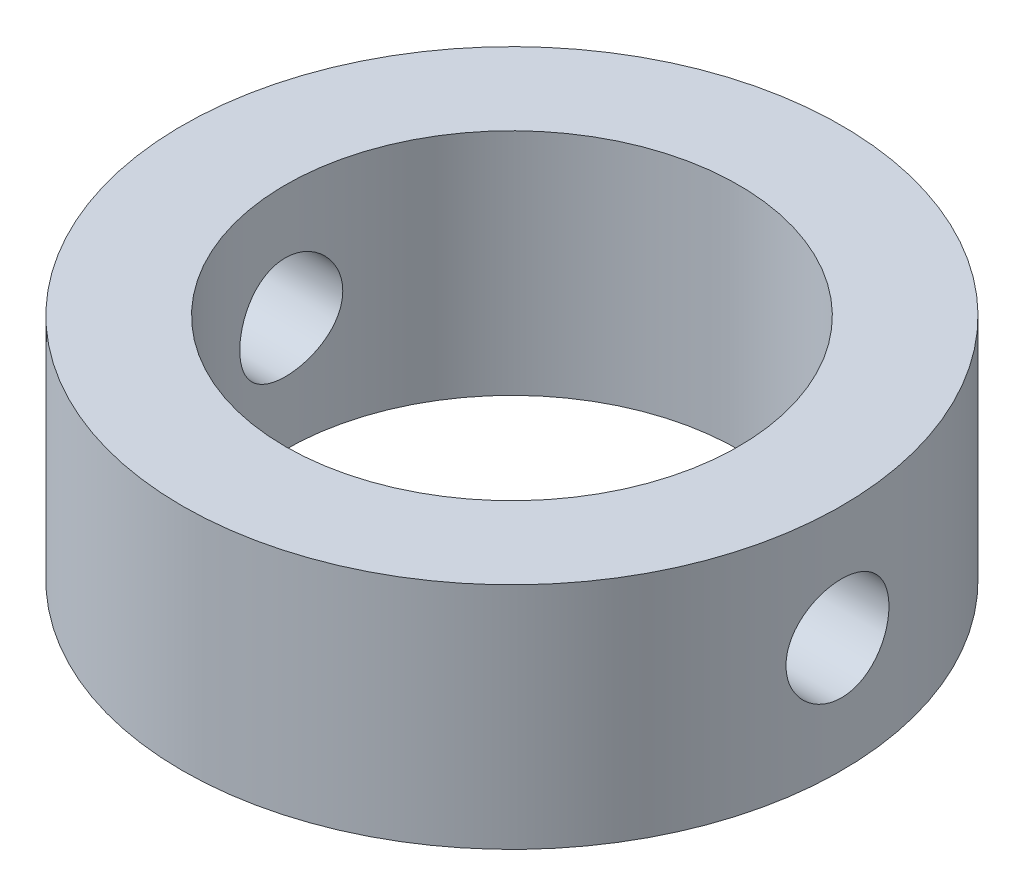
ISO-10303-21;
HEADER;
FILE_DESCRIPTION(('STEP AP214'),'2;1');
FILE_NAME('part.step','',(''),(''),'','','');
FILE_SCHEMA(('AUTOMOTIVE_DESIGN { 1 0 10303 214 1 1 1 1 }'));
ENDSEC;
DATA;
#1=APPLICATION_CONTEXT('core data for automotive mechanical design processes');
#2=APPLICATION_PROTOCOL_DEFINITION('international standard','automotive_design',2000,#1);
#3=PRODUCT_CONTEXT('',#1,'mechanical');
#4=PRODUCT('Part','Part','',(#3));
#5=PRODUCT_RELATED_PRODUCT_CATEGORY('part','',(#4));
#6=PRODUCT_DEFINITION_FORMATION('','',#4);
#7=PRODUCT_DEFINITION_CONTEXT('part definition',#1,'design');
#8=PRODUCT_DEFINITION('design','',#6,#7);
#9=PRODUCT_DEFINITION_SHAPE('','',#8);
#10=(LENGTH_UNIT() NAMED_UNIT(*) SI_UNIT(.MILLI.,.METRE.));
#11=(NAMED_UNIT(*) PLANE_ANGLE_UNIT() SI_UNIT($,.RADIAN.));
#12=(NAMED_UNIT(*) SI_UNIT($,.STERADIAN.) SOLID_ANGLE_UNIT());
#13=UNCERTAINTY_MEASURE_WITH_UNIT(LENGTH_MEASURE(1.E-05),#10,'distance_accuracy_value','');
#14=(GEOMETRIC_REPRESENTATION_CONTEXT(3) GLOBAL_UNCERTAINTY_ASSIGNED_CONTEXT((#13)) GLOBAL_UNIT_ASSIGNED_CONTEXT((#10,
#11,#12)) REPRESENTATION_CONTEXT('',''));
#15=CARTESIAN_POINT('',(0.,0.,0.));
#16=DIRECTION('',(0.,0.,1.));
#17=DIRECTION('',(1.,0.,0.));
#18=AXIS2_PLACEMENT_3D('',#15,#16,#17);
#19=CARTESIAN_POINT('',(0.,18.4550477399727,0.));
#20=DIRECTION('',(0.,1.,0.));
#21=DIRECTION('',(0.,0.,1.));
#22=AXIS2_PLACEMENT_3D('',#19,#20,#21);
#23=CYLINDRICAL_SURFACE('',#22,11.);
#24=CARTESIAN_POINT('',(-10.7121426428143,0.,-2.5));
#25=CARTESIAN_POINT('',(-10.7121454314233,0.138466190954528,-2.49999543238962));
#26=CARTESIAN_POINT('',(-10.7148566472694,0.276986082337185,-2.48845712333954));
#27=CARTESIAN_POINT('',(-10.7253866484904,0.550076575056332,-2.44266520236751));
#28=CARTESIAN_POINT('',(-10.7332089369474,0.684644401534488,-2.40839601066357));
#29=CARTESIAN_POINT('',(-10.7530304465065,0.945841058373466,-2.31828540377217));
#30=CARTESIAN_POINT('',(-10.7650248735991,1.07247880458495,-2.26246873972878));
#31=CARTESIAN_POINT('',(-10.7918333757398,1.31459839968131,-2.13091974990438));
#32=CARTESIAN_POINT('',(-10.8066474399211,1.43008029155815,-2.05518750087741));
#33=CARTESIAN_POINT('',(-10.8377278041731,1.6487154808709,-1.88448528035886));
#34=CARTESIAN_POINT('',(-10.8540139214629,1.75163578041055,-1.78922044020224));
#35=CARTESIAN_POINT('',(-10.8860302886159,1.94018250510919,-1.58279346057436));
#36=CARTESIAN_POINT('',(-10.9017604930117,2.02580751839435,-1.4716300245101));
#37=CARTESIAN_POINT('',(-10.93110941005,2.17826304827206,-1.23499021284435));
#38=CARTESIAN_POINT('',(-10.9447020098483,2.24486820043069,-1.10936512825883));
#39=CARTESIAN_POINT('',(-10.9680197641523,2.35593341841309,-0.848343855636442));
#40=CARTESIAN_POINT('',(-10.9777453878714,2.40039617113036,-0.712948855424522));
#41=CARTESIAN_POINT('',(-10.992093320832,2.4651780957488,-0.438655593897397));
#42=CARTESIAN_POINT('',(-10.9967989680676,2.48589197735748,-0.299854987503796));
#43=CARTESIAN_POINT('',(-11.0008659279287,2.5038235330812,-0.0206744590410417));
#44=CARTESIAN_POINT('',(-11.0002278985982,2.50104410026593,0.119705266442305));
#45=CARTESIAN_POINT('',(-10.9937426547597,2.47235927142653,0.395333870912044));
#46=CARTESIAN_POINT('',(-10.9879913110538,2.44687947198624,0.53062963162453));
#47=CARTESIAN_POINT('',(-10.972035500945,2.37419692034856,0.794973031158361));
#48=CARTESIAN_POINT('',(-10.9618308229987,2.32699313620665,0.92402037284203));
#49=CARTESIAN_POINT('',(-10.9379627182996,2.21183459013289,1.17336944375684));
#50=CARTESIAN_POINT('',(-10.9242729764965,2.14372109926423,1.29359524399307));
#51=CARTESIAN_POINT('',(-10.8949317146097,1.9887954880441,1.52106399956616));
#52=CARTESIAN_POINT('',(-10.8792799076932,1.90198063241803,1.62830505215689));
#53=CARTESIAN_POINT('',(-10.8473171066438,1.7098085843367,1.82929354427355));
#54=CARTESIAN_POINT('',(-10.8309992019581,1.60407898919961,1.92268414978479));
#55=CARTESIAN_POINT('',(-10.7998704044976,1.37828918426258,2.09047920073133));
#56=CARTESIAN_POINT('',(-10.7850595594488,1.25822852088493,2.16488304500243));
#57=CARTESIAN_POINT('',(-10.7586016791364,1.00657601189026,2.29276887377835));
#58=CARTESIAN_POINT('',(-10.7469656031437,0.874946246080213,2.3461786596901));
#59=CARTESIAN_POINT('',(-10.7283231226734,0.604251446260693,2.43000958929392));
#60=CARTESIAN_POINT('',(-10.7213159185924,0.465187700904694,2.46043470354816));
#61=CARTESIAN_POINT('',(-10.7128889420635,0.186845752338146,2.49686920193376));
#62=CARTESIAN_POINT('',(-10.7113498101725,0.0476393671862799,2.50340025202094));
#63=CARTESIAN_POINT('',(-10.7137104989267,-0.229873208145283,2.49327772715816));
#64=CARTESIAN_POINT('',(-10.7176099135701,-0.36817946474759,2.47662588287242));
#65=CARTESIAN_POINT('',(-10.7302951733771,-0.638118293808386,2.42106417661717));
#66=CARTESIAN_POINT('',(-10.7390169712549,-0.769814166805823,2.38244586746638));
#67=CARTESIAN_POINT('',(-10.7603057031402,-1.02486559243074,2.28436509536444));
#68=CARTESIAN_POINT('',(-10.7728730289421,-1.14822029366921,2.22490050843923));
#69=CARTESIAN_POINT('',(-10.8006961734274,-1.38533303903934,2.08568096094998));
#70=CARTESIAN_POINT('',(-10.8159929667106,-1.49889893904089,2.00560710889276));
#71=CARTESIAN_POINT('',(-10.847445444588,-1.71117330324603,1.82785558175614));
#72=CARTESIAN_POINT('',(-10.8636012445728,-1.80987976451868,1.73017553739798));
#73=CARTESIAN_POINT('',(-10.8953477425749,-1.99168109801583,1.51761489811828));
#74=CARTESIAN_POINT('',(-10.9109203453324,-2.07441892472079,1.40242575322726));
#75=CARTESIAN_POINT('',(-10.9394030007809,-2.21937081430505,1.15948167628699));
#76=CARTESIAN_POINT('',(-10.9523131827213,-2.28158587356556,1.03172735466865));
#77=CARTESIAN_POINT('',(-10.9739405859898,-2.38324041107997,0.768105049315911));
#78=CARTESIAN_POINT('',(-10.9826854368624,-2.42283032739891,0.6322974462709));
#79=CARTESIAN_POINT('',(-10.9951167589318,-2.47857654735429,0.355736283082475));
#80=CARTESIAN_POINT('',(-10.9988040274401,-2.4947365446643,0.214983506118723));
#81=CARTESIAN_POINT('',(-11.0006787302882,-2.50298711617191,-0.0640926427285491));
#82=CARTESIAN_POINT('',(-10.9989875888252,-2.49560907850598,-0.202399752438727));
#83=CARTESIAN_POINT('',(-10.9905580161125,-2.45818905132186,-0.475747789729384));
#84=CARTESIAN_POINT('',(-10.9838196900264,-2.42814753402196,-0.6107887853024));
#85=CARTESIAN_POINT('',(-10.96606448264,-2.3465163607887,-0.873322034218739));
#86=CARTESIAN_POINT('',(-10.9550636655368,-2.29500755489862,-1.00084058283969));
#87=CARTESIAN_POINT('',(-10.9299536917879,-2.17198077313979,-1.24549315867952));
#88=CARTESIAN_POINT('',(-10.9158442081789,-2.10046069231224,-1.36262609174177));
#89=CARTESIAN_POINT('',(-10.8856935133435,-1.93773803535717,-1.58575630284182));
#90=CARTESIAN_POINT('',(-10.8696188788032,-1.84616508560281,-1.69147898146279));
#91=CARTESIAN_POINT('',(-10.8375213996161,-1.64667602970222,-1.88623829979112));
#92=CARTESIAN_POINT('',(-10.8214985685478,-1.53875594541497,-1.97527086605942));
#93=CARTESIAN_POINT('',(-10.7910549272231,-1.30772800618311,-2.13539007203787));
#94=CARTESIAN_POINT('',(-10.7766611159887,-1.18442028714458,-2.2061937971019));
#95=CARTESIAN_POINT('',(-10.7514502387736,-0.927351148743042,-2.32596037579883));
#96=CARTESIAN_POINT('',(-10.7406302556445,-0.793598366019797,-2.37494105401434));
#97=CARTESIAN_POINT('',(-10.72571344068,-0.54983204252996,-2.44129910462464));
#98=CARTESIAN_POINT('',(-10.7206593017667,-0.441103827426283,-2.46326828297558));
#99=CARTESIAN_POINT('',(-10.7138728814852,-0.221595128190535,-2.49262014337059));
#100=CARTESIAN_POINT('',(-10.712140411085,-0.110814761206151,-2.50000365546745));
#101=CARTESIAN_POINT('',(-10.7121426428143,0.,-2.5));
#102=B_SPLINE_CURVE_WITH_KNOTS('',3,(#24,#25,#26,#27,#28,#29,#30,#31,#32,#33,#34,#35,#36,#37,
#38,#39,#40,#41,#42,#43,#44,#45,#46,#47,#48,#49,#50,#51,#52,#53,#54,#55,#56,#57,#58,#59,#60,#61,
#62,#63,#64,#65,#66,#67,#68,#69,#70,#71,#72,#73,#74,#75,#76,#77,#78,#79,#80,#81,#82,#83,#84,#85,
#86,#87,#88,#89,#90,#91,#92,#93,#94,#95,#96,#97,#98,#99,#100,#101),.UNSPECIFIED.,.T.,.F.,(4,2,2,
2,2,2,2,2,2,2,2,2,2,2,2,2,2,2,2,2,2,2,2,2,2,2,2,2,2,2,2,2,2,2,2,2,2,2,4),(0.,0.414992243301631,
0.83026921724478,1.2450705835768,1.65987035130107,2.08146637272044,2.5030967965796,
2.92953338750108,3.35591821939512,3.77510878183784,4.1942477240696,4.60569006667321,
5.01715195585207,5.43181796836808,5.84654467145158,6.27057865094874,6.69462605466424,
7.12011925968861,7.54553894468119,7.96161330230364,8.37765660054312,8.78830262277903,
9.19899049685668,9.61646120958421,10.0339881436657,10.4599792598124,10.8859496910277,
11.3090538013157,11.7320912029453,12.1456463784943,12.5591929374091,12.9711958750873,
13.3832421670976,13.8036601623803,14.2241806329332,14.6508801056332,15.0772304178392,
15.4093684172414,15.7414875145232),.UNSPECIFIED.);
#103=CARTESIAN_POINT('',(-10.7121426428143,0.,-2.5));
#104=VERTEX_POINT('',#103);
#105=EDGE_CURVE('E76',#104,#104,#102,.T.);
#106=ORIENTED_EDGE('',*,*,#105,.F.);
#107=EDGE_LOOP('',(#106));
#108=FACE_BOUND('',#107,.T.);
#109=CARTESIAN_POINT('',(10.7121426428143,0.,-2.5));
#110=CARTESIAN_POINT('',(10.7121454314233,-0.138466190954528,-2.49999543238962));
#111=CARTESIAN_POINT('',(10.7148566472694,-0.276986082337185,-2.48845712333954));
#112=CARTESIAN_POINT('',(10.7253866484904,-0.550076575056332,-2.44266520236751));
#113=CARTESIAN_POINT('',(10.7332089369474,-0.684644401534488,-2.40839601066357));
#114=CARTESIAN_POINT('',(10.7530304465065,-0.945841058373466,-2.31828540377217));
#115=CARTESIAN_POINT('',(10.7650248735991,-1.07247880458495,-2.26246873972878));
#116=CARTESIAN_POINT('',(10.7918333757398,-1.31459839968131,-2.13091974990438));
#117=CARTESIAN_POINT('',(10.8066474399211,-1.43008029155815,-2.05518750087741));
#118=CARTESIAN_POINT('',(10.8377278041731,-1.6487154808709,-1.88448528035886));
#119=CARTESIAN_POINT('',(10.8540139214629,-1.75163578041055,-1.78922044020224));
#120=CARTESIAN_POINT('',(10.8860302886159,-1.94018250510919,-1.58279346057436));
#121=CARTESIAN_POINT('',(10.9017604930117,-2.02580751839435,-1.4716300245101));
#122=CARTESIAN_POINT('',(10.93110941005,-2.17826304827206,-1.23499021284435));
#123=CARTESIAN_POINT('',(10.9447020098483,-2.24486820043069,-1.10936512825883));
#124=CARTESIAN_POINT('',(10.9680197641523,-2.35593341841309,-0.848343855636442));
#125=CARTESIAN_POINT('',(10.9777453878714,-2.40039617113036,-0.712948855424522));
#126=CARTESIAN_POINT('',(10.992093320832,-2.4651780957488,-0.438655593897397));
#127=CARTESIAN_POINT('',(10.9967989680676,-2.48589197735748,-0.299854987503796));
#128=CARTESIAN_POINT('',(11.0008659279287,-2.5038235330812,-0.0206744590410417));
#129=CARTESIAN_POINT('',(11.0002278985982,-2.50104410026593,0.119705266442305));
#130=CARTESIAN_POINT('',(10.9937426547597,-2.47235927142653,0.395333870912044));
#131=CARTESIAN_POINT('',(10.9879913110538,-2.44687947198624,0.53062963162453));
#132=CARTESIAN_POINT('',(10.972035500945,-2.37419692034856,0.794973031158361));
#133=CARTESIAN_POINT('',(10.9618308229987,-2.32699313620665,0.92402037284203));
#134=CARTESIAN_POINT('',(10.9379627182996,-2.21183459013289,1.17336944375684));
#135=CARTESIAN_POINT('',(10.9242729764965,-2.14372109926423,1.29359524399307));
#136=CARTESIAN_POINT('',(10.8949317146097,-1.9887954880441,1.52106399956616));
#137=CARTESIAN_POINT('',(10.8792799076932,-1.90198063241803,1.62830505215689));
#138=CARTESIAN_POINT('',(10.8473171066438,-1.7098085843367,1.82929354427355));
#139=CARTESIAN_POINT('',(10.8309992019581,-1.60407898919961,1.92268414978479));
#140=CARTESIAN_POINT('',(10.7998704044976,-1.37828918426258,2.09047920073133));
#141=CARTESIAN_POINT('',(10.7850595594488,-1.25822852088493,2.16488304500243));
#142=CARTESIAN_POINT('',(10.7586016791364,-1.00657601189026,2.29276887377835));
#143=CARTESIAN_POINT('',(10.7469656031437,-0.874946246080213,2.3461786596901));
#144=CARTESIAN_POINT('',(10.7283231226734,-0.604251446260693,2.43000958929392));
#145=CARTESIAN_POINT('',(10.7213159185924,-0.465187700904694,2.46043470354816));
#146=CARTESIAN_POINT('',(10.7128889420635,-0.186845752338146,2.49686920193376));
#147=CARTESIAN_POINT('',(10.7113498101725,-0.0476393671862799,2.50340025202094));
#148=CARTESIAN_POINT('',(10.7137104989267,0.229873208145283,2.49327772715816));
#149=CARTESIAN_POINT('',(10.7176099135701,0.36817946474759,2.47662588287242));
#150=CARTESIAN_POINT('',(10.7302951733771,0.638118293808386,2.42106417661717));
#151=CARTESIAN_POINT('',(10.7390169712549,0.769814166805823,2.38244586746638));
#152=CARTESIAN_POINT('',(10.7603057031402,1.02486559243074,2.28436509536444));
#153=CARTESIAN_POINT('',(10.7728730289421,1.14822029366921,2.22490050843923));
#154=CARTESIAN_POINT('',(10.8006961734274,1.38533303903934,2.08568096094998));
#155=CARTESIAN_POINT('',(10.8159929667106,1.49889893904089,2.00560710889276));
#156=CARTESIAN_POINT('',(10.847445444588,1.71117330324603,1.82785558175614));
#157=CARTESIAN_POINT('',(10.8636012445728,1.80987976451868,1.73017553739798));
#158=CARTESIAN_POINT('',(10.8953477425749,1.99168109801583,1.51761489811828));
#159=CARTESIAN_POINT('',(10.9109203453324,2.07441892472079,1.40242575322726));
#160=CARTESIAN_POINT('',(10.9394030007809,2.21937081430505,1.15948167628699));
#161=CARTESIAN_POINT('',(10.9523131827213,2.28158587356556,1.03172735466865));
#162=CARTESIAN_POINT('',(10.9739405859898,2.38324041107997,0.768105049315911));
#163=CARTESIAN_POINT('',(10.9826854368624,2.42283032739891,0.6322974462709));
#164=CARTESIAN_POINT('',(10.9951167589318,2.47857654735429,0.355736283082475));
#165=CARTESIAN_POINT('',(10.9988040274401,2.4947365446643,0.214983506118723));
#166=CARTESIAN_POINT('',(11.0006787302882,2.50298711617191,-0.0640926427285491));
#167=CARTESIAN_POINT('',(10.9989875888252,2.49560907850598,-0.202399752438727));
#168=CARTESIAN_POINT('',(10.9905580161125,2.45818905132186,-0.475747789729384));
#169=CARTESIAN_POINT('',(10.9838196900264,2.42814753402196,-0.6107887853024));
#170=CARTESIAN_POINT('',(10.96606448264,2.3465163607887,-0.873322034218739));
#171=CARTESIAN_POINT('',(10.9550636655368,2.29500755489862,-1.00084058283969));
#172=CARTESIAN_POINT('',(10.9299536917879,2.17198077313979,-1.24549315867952));
#173=CARTESIAN_POINT('',(10.9158442081789,2.10046069231224,-1.36262609174177));
#174=CARTESIAN_POINT('',(10.8856935133435,1.93773803535717,-1.58575630284182));
#175=CARTESIAN_POINT('',(10.8696188788032,1.84616508560281,-1.69147898146279));
#176=CARTESIAN_POINT('',(10.8375213996161,1.64667602970222,-1.88623829979112));
#177=CARTESIAN_POINT('',(10.8214985685478,1.53875594541497,-1.97527086605942));
#178=CARTESIAN_POINT('',(10.7910549272231,1.30772800618311,-2.13539007203787));
#179=CARTESIAN_POINT('',(10.7766611159887,1.18442028714458,-2.2061937971019));
#180=CARTESIAN_POINT('',(10.7514502387736,0.927351148743042,-2.32596037579883));
#181=CARTESIAN_POINT('',(10.7406302556445,0.793598366019797,-2.37494105401434));
#182=CARTESIAN_POINT('',(10.72571344068,0.54983204252996,-2.44129910462464));
#183=CARTESIAN_POINT('',(10.7206593017667,0.441103827426283,-2.46326828297558));
#184=CARTESIAN_POINT('',(10.7138728814852,0.221595128190535,-2.49262014337059));
#185=CARTESIAN_POINT('',(10.712140411085,0.110814761206151,-2.50000365546745));
#186=CARTESIAN_POINT('',(10.7121426428143,0.,-2.5));
#187=B_SPLINE_CURVE_WITH_KNOTS('',3,(#109,#110,#111,#112,#113,#114,#115,#116,#117,#118,#119,
#120,#121,#122,#123,#124,#125,#126,#127,#128,#129,#130,#131,#132,#133,#134,#135,#136,#137,#138,
#139,#140,#141,#142,#143,#144,#145,#146,#147,#148,#149,#150,#151,#152,#153,#154,#155,#156,#157,
#158,#159,#160,#161,#162,#163,#164,#165,#166,#167,#168,#169,#170,#171,#172,#173,#174,#175,#176,
#177,#178,#179,#180,#181,#182,#183,#184,#185,#186),.UNSPECIFIED.,.T.,.F.,(4,2,2,2,2,2,2,2,2,2,2,
2,2,2,2,2,2,2,2,2,2,2,2,2,2,2,2,2,2,2,2,2,2,2,2,2,2,2,4),(0.,0.414992243301631,0.83026921724478,
1.2450705835768,1.65987035130107,2.08146637272044,2.5030967965796,2.92953338750108,
3.35591821939512,3.77510878183784,4.1942477240696,4.60569006667321,5.01715195585207,
5.43181796836808,5.84654467145158,6.27057865094874,6.69462605466424,7.12011925968861,
7.54553894468119,7.96161330230364,8.37765660054312,8.78830262277903,9.19899049685668,
9.61646120958421,10.0339881436657,10.4599792598124,10.8859496910277,11.3090538013157,
11.7320912029453,12.1456463784943,12.5591929374091,12.9711958750873,13.3832421670976,
13.8036601623803,14.2241806329332,14.6508801056332,15.0772304178392,15.4093684172414,
15.7414875145232),.UNSPECIFIED.);
#188=CARTESIAN_POINT('',(10.7121426428143,0.,-2.5));
#189=VERTEX_POINT('',#188);
#190=EDGE_CURVE('E71',#189,#189,#187,.T.);
#191=ORIENTED_EDGE('',*,*,#190,.F.);
#192=EDGE_LOOP('',(#191));
#193=FACE_BOUND('',#192,.T.);
#194=CARTESIAN_POINT('',(0.,5.5630048211401,0.));
#195=DIRECTION('',(0.,1.,0.));
#196=DIRECTION('',(0.,0.,1.));
#197=AXIS2_PLACEMENT_3D('',#194,#195,#196);
#198=CIRCLE('',#197,11.);
#199=CARTESIAN_POINT('',(0.,5.5630048211401,11.));
#200=VERTEX_POINT('',#199);
#201=EDGE_CURVE('E47',#200,#200,#198,.T.);
#202=ORIENTED_EDGE('',*,*,#201,.T.);
#203=EDGE_LOOP('',(#202));
#204=FACE_BOUND('',#203,.T.);
#205=CARTESIAN_POINT('',(0.,-5.5630048211401,0.));
#206=DIRECTION('',(0.,1.,0.));
#207=DIRECTION('',(0.,0.,1.));
#208=AXIS2_PLACEMENT_3D('',#205,#206,#207);
#209=CIRCLE('',#208,11.);
#210=CARTESIAN_POINT('',(0.,-5.5630048211401,11.));
#211=VERTEX_POINT('',#210);
#212=EDGE_CURVE('E82',#211,#211,#209,.T.);
#213=ORIENTED_EDGE('',*,*,#212,.F.);
#214=EDGE_LOOP('',(#213));
#215=FACE_BOUND('',#214,.T.);
#216=ADVANCED_FACE('F31',(#108,#193,#204,#215),#23,.F.);
#217=CARTESIAN_POINT('',(-16.,5.5630048211401,0.));
#218=DIRECTION('',(0.,1.,0.));
#219=DIRECTION('',(0.,0.,1.));
#220=AXIS2_PLACEMENT_3D('',#217,#218,#219);
#221=PLANE('',#220);
#222=CARTESIAN_POINT('',(0.,5.5630048211401,0.));
#223=DIRECTION('',(0.,1.,0.));
#224=DIRECTION('',(0.,0.,1.));
#225=AXIS2_PLACEMENT_3D('',#222,#223,#224);
#226=CIRCLE('',#225,16.);
#227=CARTESIAN_POINT('',(0.,5.5630048211401,16.));
#228=VERTEX_POINT('',#227);
#229=EDGE_CURVE('E51',#228,#228,#226,.T.);
#230=ORIENTED_EDGE('',*,*,#229,.T.);
#231=EDGE_LOOP('',(#230));
#232=FACE_BOUND('',#231,.T.);
#233=ORIENTED_EDGE('',*,*,#201,.F.);
#234=EDGE_LOOP('',(#233));
#235=FACE_BOUND('',#234,.T.);
#236=ADVANCED_FACE('F90',(#232,#235),#221,.T.);
#237=CARTESIAN_POINT('',(0.,18.4550477399727,0.));
#238=DIRECTION('',(0.,1.,0.));
#239=DIRECTION('',(0.,0.,1.));
#240=AXIS2_PLACEMENT_3D('',#237,#238,#239);
#241=CYLINDRICAL_SURFACE('',#240,16.);
#242=CARTESIAN_POINT('',(-16.,2.5,0.));
#243=CARTESIAN_POINT('',(-15.9999977019448,2.49999430172848,-0.139515097271033));
#244=CARTESIAN_POINT('',(-15.9981561248574,2.48828188622644,-0.279109404865704));
#245=CARTESIAN_POINT('',(-15.9909869809759,2.44175630872324,-0.554391314978102));
#246=CARTESIAN_POINT('',(-15.9856560884472,2.40692110749649,-0.690075061323317));
#247=CARTESIAN_POINT('',(-15.9721069716578,2.31522033719338,-0.953512538047404));
#248=CARTESIAN_POINT('',(-15.9638909956317,2.2583719186384,-1.0812723522899));
#249=CARTESIAN_POINT('',(-15.9454779403815,2.12430145485839,-1.3254212510446));
#250=CARTESIAN_POINT('',(-15.9352811186255,2.04708205696406,-1.44181181036831));
#251=CARTESIAN_POINT('',(-15.9139426841436,1.87376695164604,-1.66091991165162));
#252=CARTESIAN_POINT('',(-15.9027945139234,1.77753300510975,-1.76352747914264));
#253=CARTESIAN_POINT('',(-15.8808607613029,1.56921805173111,-1.95120768822823));
#254=CARTESIAN_POINT('',(-15.8700752005075,1.4571361026998,-2.03627928654192));
#255=CARTESIAN_POINT('',(-15.8500242812745,1.21956172865627,-2.18690544328884));
#256=CARTESIAN_POINT('',(-15.840767397861,1.09400051763821,-2.25235273557992));
#257=CARTESIAN_POINT('',(-15.8249120174236,0.833498589142195,-2.36118681597065));
#258=CARTESIAN_POINT('',(-15.8183133630222,0.69855842748944,-2.40457491010063));
#259=CARTESIAN_POINT('',(-15.8085863451104,0.424289098856214,-2.46771559322167));
#260=CARTESIAN_POINT('',(-15.8054302653236,0.285004414181201,-2.48765705487496));
#261=CARTESIAN_POINT('',(-15.8028617107177,0.00503281110735576,-2.50392369757621));
#262=CARTESIAN_POINT('',(-15.8034490028802,-0.13565401946604,-2.50025034860466));
#263=CARTESIAN_POINT('',(-15.8082755045521,-0.413097031852685,-2.4695458080889));
#264=CARTESIAN_POINT('',(-15.8124817218495,-0.549877223353148,-2.44272562959693));
#265=CARTESIAN_POINT('',(-15.8240205634547,-0.816972006359324,-2.36681937833751));
#266=CARTESIAN_POINT('',(-15.8313532830641,-0.947286400640537,-2.31773262684132));
#267=CARTESIAN_POINT('',(-15.8483550685462,-1.19838871267716,-2.19846916949384));
#268=CARTESIAN_POINT('',(-15.8580339308724,-1.31913379177307,-2.12820372315549));
#269=CARTESIAN_POINT('',(-15.878630461501,-1.54719953568554,-1.96864058146637));
#270=CARTESIAN_POINT('',(-15.8895482178821,-1.65451924488747,-1.87934153253016));
#271=CARTESIAN_POINT('',(-15.911537862489,-1.85391024663331,-1.68309088822333));
#272=CARTESIAN_POINT('',(-15.9226101363559,-1.94580315826946,-1.57595800560539));
#273=CARTESIAN_POINT('',(-15.9435512534783,-2.1103331456399,-1.34769694737936));
#274=CARTESIAN_POINT('',(-15.9534200906202,-2.18297012355683,-1.22656870068132));
#275=CARTESIAN_POINT('',(-15.9708539902704,-2.30693807342239,-0.973595927056491));
#276=CARTESIAN_POINT('',(-15.9784174854193,-2.358254558533,-0.84174418624046));
#277=CARTESIAN_POINT('',(-15.9903756000068,-2.43796596744723,-0.571149534696759));
#278=CARTESIAN_POINT('',(-15.9947704520898,-2.46636257406648,-0.4324071306872));
#279=CARTESIAN_POINT('',(-15.9998651172728,-2.49918927645019,-0.153508336763735));
#280=CARTESIAN_POINT('',(-16.0006027179286,-2.50386447897618,-0.0133814615087019));
#281=CARTESIAN_POINT('',(-15.9984028649127,-2.48976729466402,0.265654546411642));
#282=CARTESIAN_POINT('',(-15.9954655349964,-2.47099569741089,0.404563719925156));
#283=CARTESIAN_POINT('',(-15.9862692369322,-2.41074161231982,0.676473446265705));
#284=CARTESIAN_POINT('',(-15.9800278421539,-2.36937924173227,0.809501262056042));
#285=CARTESIAN_POINT('',(-15.9649207568356,-2.26524490560121,1.06673406785663));
#286=CARTESIAN_POINT('',(-15.9560549341007,-2.20247186155733,1.19093861303941));
#287=CARTESIAN_POINT('',(-15.9365897274094,-2.05672800887342,1.42807220225041));
#288=CARTESIAN_POINT('',(-15.9259772866342,-1.97360257990952,1.54090512378372));
#289=CARTESIAN_POINT('',(-15.9042388046444,-1.78972791409221,1.75110696507806));
#290=CARTESIAN_POINT('',(-15.8931127309268,-1.68897756079515,1.84847490447018));
#291=CARTESIAN_POINT('',(-15.8714802753665,-1.47161880278279,2.02588080776691));
#292=CARTESIAN_POINT('',(-15.860980411908,-1.35487515287767,2.10575398584126));
#293=CARTESIAN_POINT('',(-15.8419069280583,-1.10948392633867,2.2447556772664));
#294=CARTESIAN_POINT('',(-15.83333325222,-0.980836692510525,2.30388478778105));
#295=CARTESIAN_POINT('',(-15.8191307135236,-0.71577035928581,2.39946771944995));
#296=CARTESIAN_POINT('',(-15.8134908234896,-0.579382531234378,2.43600654947912));
#297=CARTESIAN_POINT('',(-15.8057657028079,-0.30231085633602,2.48564122040535));
#298=CARTESIAN_POINT('',(-15.8036802038444,-0.161627334580993,2.49873883084997));
#299=CARTESIAN_POINT('',(-15.8033105804488,0.118398715907475,2.50107452690756));
#300=CARTESIAN_POINT('',(-15.804985160429,0.257739096933502,2.49057180548425));
#301=CARTESIAN_POINT('',(-15.8118569894183,0.532645297144285,2.44656223255901));
#302=CARTESIAN_POINT('',(-15.8170542307995,0.668211124501715,2.41305543086961));
#303=CARTESIAN_POINT('',(-15.8303708885491,0.931637826640519,2.32408329891852));
#304=CARTESIAN_POINT('',(-15.8384876895341,1.05950547825841,2.26863761738581));
#305=CARTESIAN_POINT('',(-15.856731840474,1.30416561367627,2.13738768546417));
#306=CARTESIAN_POINT('',(-15.8668592701083,1.42095765828843,2.06158262820886));
#307=CARTESIAN_POINT('',(-15.8881156809226,1.64146554412683,1.8908300813908));
#308=CARTESIAN_POINT('',(-15.8992540116029,1.74503219661384,1.79569107094768));
#309=CARTESIAN_POINT('',(-15.9212004364073,1.93482123638673,1.58937594638204));
#310=CARTESIAN_POINT('',(-15.9320084534012,2.02103959859188,1.47819612078432));
#311=CARTESIAN_POINT('',(-15.952151024567,2.17415122303156,1.24216685884341));
#312=CARTESIAN_POINT('',(-15.9614763443027,2.24092537275961,1.11723937214238));
#313=CARTESIAN_POINT('',(-15.9775125983888,2.35244099619295,0.857851882357784));
#314=CARTESIAN_POINT('',(-15.9842262014212,2.39720497255839,0.723401776581762));
#315=CARTESIAN_POINT('',(-15.9927744586488,2.45343302109059,0.490314239911593));
#316=CARTESIAN_POINT('',(-15.9954699162612,2.470868490629,0.393105575651624));
#317=CARTESIAN_POINT('',(-15.9990834869762,2.49415391337908,0.197277797850582));
#318=CARTESIAN_POINT('',(-16.0000016250796,2.50000402955734,0.0986587041691184));
#319=CARTESIAN_POINT('',(-16.,2.5,0.));
#320=B_SPLINE_CURVE_WITH_KNOTS('',3,(#242,#243,#244,#245,#246,#247,#248,#249,#250,#251,#252,
#253,#254,#255,#256,#257,#258,#259,#260,#261,#262,#263,#264,#265,#266,#267,#268,#269,#270,#271,
#272,#273,#274,#275,#276,#277,#278,#279,#280,#281,#282,#283,#284,#285,#286,#287,#288,#289,#290,
#291,#292,#293,#294,#295,#296,#297,#298,#299,#300,#301,#302,#303,#304,#305,#306,#307,#308,#309,
#310,#311,#312,#313,#314,#315,#316,#317,#318,#319),.UNSPECIFIED.,.T.,.F.,(4,2,2,2,2,2,2,2,2,2,2,
2,2,2,2,2,2,2,2,2,2,2,2,2,2,2,2,2,2,2,2,2,2,2,2,2,2,2,4),(0.,0.418184740477491,
0.836768642528014,1.25502707944103,1.6732311879203,2.09459568152199,2.51598523645422,
2.93963778605759,3.36326525009238,3.78345631134995,4.20362121670545,4.6199957602258,
5.0363829965105,5.45453977402347,5.87272629892068,6.29545732334367,6.71819049513827,
7.14121043754565,7.56419931829866,7.98280854005914,8.40140366528356,8.81779444756567,
9.23420620742031,9.65388541469671,10.0735912160142,10.4970948024959,10.9205861964898,
11.3424741039513,11.764330162293,12.1815758159869,12.598820566189,13.0156924696662,
13.4325808967135,13.8538201231554,14.275156971423,14.6990230419984,15.1224548565628,
15.4181801635154,15.7139013105871),.UNSPECIFIED.);
#321=CARTESIAN_POINT('',(-16.,2.5,0.));
#322=VERTEX_POINT('',#321);
#323=EDGE_CURVE('E10',#322,#322,#320,.T.);
#324=ORIENTED_EDGE('',*,*,#323,.F.);
#325=EDGE_LOOP('',(#324));
#326=FACE_BOUND('',#325,.T.);
#327=CARTESIAN_POINT('',(15.8034806292791,0.,-2.5));
#328=CARTESIAN_POINT('',(15.8034830346332,0.139503378340977,-2.49999429179104));
#329=CARTESIAN_POINT('',(15.8053478026579,0.279085997685314,-2.48828377742084));
#330=CARTESIAN_POINT('',(15.8125997089632,0.554343629002854,-2.44176643645043));
#331=CARTESIAN_POINT('',(15.8179902148259,0.690014775479362,-2.40693752801736));
#332=CARTESIAN_POINT('',(15.8316684916183,0.953425589644386,-2.31525516047132));
#333=CARTESIAN_POINT('',(15.8399539668268,1.08117144787076,-2.25841914921921));
#334=CARTESIAN_POINT('',(15.8584858981599,1.32529689084211,-2.12437791816389));
#335=CARTESIAN_POINT('',(15.8687321022282,1.44167793365954,-2.04717531605122));
#336=CARTESIAN_POINT('',(15.8901303851737,1.66079648515127,-1.8738773011091));
#337=CARTESIAN_POINT('',(15.9012888784461,1.76342107439964,-1.77763988617499));
#338=CARTESIAN_POINT('',(15.9231973082665,1.95113422042993,-1.56931080987671));
#339=CARTESIAN_POINT('',(15.9339472216983,2.03622178622429,-1.45721825316848));
#340=CARTESIAN_POINT('',(15.9538946715316,2.18686487704115,-1.21963429185761));
#341=CARTESIAN_POINT('',(15.9630838016344,2.25231600397446,-1.09407592635729));
#342=CARTESIAN_POINT('',(15.978803149105,2.36115795472508,-0.833580171794755));
#343=CARTESIAN_POINT('',(15.9853335186778,2.40455004138267,-0.698643320136809));
#344=CARTESIAN_POINT('',(15.9949542857973,2.46769871895616,-0.42438532544881));
#345=CARTESIAN_POINT('',(15.9980722260505,2.48764464906835,-0.28510876016075));
#346=CARTESIAN_POINT('',(16.0006113098095,2.50392304330337,-0.00515314355066946));
#347=CARTESIAN_POINT('',(16.0000326754547,2.50025692635184,0.135525822989188));
#348=CARTESIAN_POINT('',(15.9952657389868,2.46956407372214,0.413000089722152));
#349=CARTESIAN_POINT('',(15.9911089169598,2.44274106115968,0.549818542575175));
#350=CARTESIAN_POINT('',(15.9796877395528,2.36681597137738,0.816988375343492));
#351=CARTESIAN_POINT('',(15.9724232987387,2.31771328164586,0.947339577352176));
#352=CARTESIAN_POINT('',(15.9555491842028,2.19841634413995,1.19848742679247));
#353=CARTESIAN_POINT('',(15.9459300777042,2.12813699457205,1.31924299071837));
#354=CARTESIAN_POINT('',(15.9254174702046,1.96854391937076,1.54732385653213));
#355=CARTESIAN_POINT('',(15.9145238783282,1.87922883604501,1.65464819959324));
#356=CARTESIAN_POINT('',(15.8925387825556,1.68296651292673,1.85402198520023));
#357=CARTESIAN_POINT('',(15.8814464071021,1.57584133360514,1.94589625613075));
#358=CARTESIAN_POINT('',(15.8604269384475,1.34760243531787,2.11039226047485));
#359=CARTESIAN_POINT('',(15.8504998536298,1.22648861572594,2.18301385538335));
#360=CARTESIAN_POINT('',(15.8329349281613,0.973520371894197,2.30697060635685));
#361=CARTESIAN_POINT('',(15.8252991458489,0.841656424926548,2.35828663884161));
#362=CARTESIAN_POINT('',(15.8132168990948,0.57103515129452,2.43799343127668));
#363=CARTESIAN_POINT('',(15.8087701897074,0.432278354930278,2.46638595195258));
#364=CARTESIAN_POINT('',(15.8036163696886,0.153371896724788,2.49919719237856));
#365=CARTESIAN_POINT('',(15.80287044806,0.0132521998052415,2.50386473411271));
#366=CARTESIAN_POINT('',(15.8050994977182,-0.265767635297906,2.48975479033184));
#367=CARTESIAN_POINT('',(15.8080743433524,-0.404667814505862,2.47097809654328));
#368=CARTESIAN_POINT('',(15.8173740105186,-0.676527807466474,2.41072412555895));
#369=CARTESIAN_POINT('',(15.8236803883335,-0.8095159986396,2.36937178781979));
#370=CARTESIAN_POINT('',(15.8389172439685,-1.06667397110389,2.26527072241932));
#371=CARTESIAN_POINT('',(15.8478478614411,-1.19084328264902,2.20252085602949));
#372=CARTESIAN_POINT('',(15.8674179220711,-1.42795128164882,2.05681199170293));
#373=CARTESIAN_POINT('',(15.8780706945976,-1.54079022889997,1.97369251093471));
#374=CARTESIAN_POINT('',(15.8998450469621,-1.75100698084821,1.78982593995283));
#375=CARTESIAN_POINT('',(15.9109666556111,-1.84838383360704,1.6890777652142));
#376=CARTESIAN_POINT('',(15.9325473887455,-2.02581127063547,1.47171546765808));
#377=CARTESIAN_POINT('',(15.9429995842164,-2.10569657643007,1.35496564158984));
#378=CARTESIAN_POINT('',(15.9619548934084,-2.24471951999023,1.10955861029337));
#379=CARTESIAN_POINT('',(15.9704580640831,-2.30385776404594,0.98090175316249));
#380=CARTESIAN_POINT('',(15.9845269767683,-2.39944627528415,0.715839663778324));
#381=CARTESIAN_POINT('',(15.9901042225572,-2.43598549743941,0.579467147617086));
#382=CARTESIAN_POINT('',(15.9977412978946,-2.48562613267281,0.302427949770743));
#383=CARTESIAN_POINT('',(15.9998013804089,-2.49872923135596,0.161761577654428));
#384=CARTESIAN_POINT('',(16.0001691012796,-2.50108185265522,-0.118272165188273));
#385=CARTESIAN_POINT('',(15.9985164403994,-2.49058374464276,-0.257637428859788));
#386=CARTESIAN_POINT('',(15.9917247801431,-2.44657468381965,-0.532594595464885));
#387=CARTESIAN_POINT('',(15.9865857947973,-2.41306382362158,-0.668186513581644));
#388=CARTESIAN_POINT('',(15.9733964142131,-2.32407274028764,-0.931668850429403));
#389=CARTESIAN_POINT('',(15.965348528289,-2.26861144841907,-1.05956579651625));
#390=CARTESIAN_POINT('',(15.947223323121,-2.13732116147798,-1.30427807253219));
#391=CARTESIAN_POINT('',(15.9371459268214,-2.06149139302579,-1.42109298145458));
#392=CARTESIAN_POINT('',(15.9159528222148,-1.89071055679162,-1.64160219185804));
#393=CARTESIAN_POINT('',(15.9048276353277,-1.79557368569597,-1.745151694824));
#394=CARTESIAN_POINT('',(15.8828612878644,-1.5892700426646,-1.93490712736948));
#395=CARTESIAN_POINT('',(15.8720201944801,-1.4780995182753,-2.02110898563013));
#396=CARTESIAN_POINT('',(15.8517779742959,-1.24207889572461,-2.17420151541622));
#397=CARTESIAN_POINT('',(15.842386091806,-1.11714904139029,-2.24097044145097));
#398=CARTESIAN_POINT('',(15.8262143333515,-0.857756782369972,-2.35247565604314));
#399=CARTESIAN_POINT('',(15.8194317848938,-0.723304298883418,-2.3972345005847));
#400=CARTESIAN_POINT('',(15.8107909670081,-0.490230260303602,-2.45344906957713));
#401=CARTESIAN_POINT('',(15.8080643798014,-0.393038400015115,-2.47087849275467));
#402=CARTESIAN_POINT('',(15.804408373768,-0.19724421895363,-2.49415589078729));
#403=CARTESIAN_POINT('',(15.8034789284691,-0.0986419189782413,-2.50000403623692));
#404=CARTESIAN_POINT('',(15.8034806292791,0.,-2.5));
#405=B_SPLINE_CURVE_WITH_KNOTS('',3,(#327,#328,#329,#330,#331,#332,#333,#334,#335,#336,#337,
#338,#339,#340,#341,#342,#343,#344,#345,#346,#347,#348,#349,#350,#351,#352,#353,#354,#355,#356,
#357,#358,#359,#360,#361,#362,#363,#364,#365,#366,#367,#368,#369,#370,#371,#372,#373,#374,#375,
#376,#377,#378,#379,#380,#381,#382,#383,#384,#385,#386,#387,#388,#389,#390,#391,#392,#393,#394,
#395,#396,#397,#398,#399,#400,#401,#402,#403,#404),.UNSPECIFIED.,.T.,.F.,(4,2,2,2,2,2,2,2,2,2,2,
2,2,2,2,2,2,2,2,2,2,2,2,2,2,2,2,2,2,2,2,2,2,2,2,2,2,2,4),(0.,0.418149527902241,
0.836699032574078,1.25491737645053,1.67308199345223,2.09449258051085,2.51592697424482,
2.93956378022295,3.36317633102573,3.78334397517517,4.20348637030326,4.61996979150785,
5.03646466334576,5.45465612930833,5.87287743207563,6.29556043395287,6.71824647655855,
7.14131110038651,7.56434322607052,7.98292940034458,8.40150143908464,8.81778013452042,
9.23408098683358,9.65377352836981,10.0734918986585,10.4970197199928,10.9205351635679,
11.3423727623224,11.7641800198745,12.18149834073,12.5988149821383,13.0157724881518,
13.432745828047,13.8539404040181,14.275233715164,14.6991122166338,15.1225554163993,
15.4182305458031,15.7139013198206),.UNSPECIFIED.);
#406=CARTESIAN_POINT('',(15.8034806292791,0.,-2.5));
#407=VERTEX_POINT('',#406);
#408=EDGE_CURVE('E43',#407,#407,#405,.T.);
#409=ORIENTED_EDGE('',*,*,#408,.F.);
#410=EDGE_LOOP('',(#409));
#411=FACE_BOUND('',#410,.T.);
#412=CARTESIAN_POINT('',(0.,-5.5630048211401,0.));
#413=DIRECTION('',(0.,1.,0.));
#414=DIRECTION('',(0.,0.,1.));
#415=AXIS2_PLACEMENT_3D('',#412,#413,#414);
#416=CIRCLE('',#415,16.);
#417=CARTESIAN_POINT('',(0.,-5.5630048211401,16.));
#418=VERTEX_POINT('',#417);
#419=EDGE_CURVE('E85',#418,#418,#416,.T.);
#420=ORIENTED_EDGE('',*,*,#419,.T.);
#421=EDGE_LOOP('',(#420));
#422=FACE_BOUND('',#421,.T.);
#423=ORIENTED_EDGE('',*,*,#229,.F.);
#424=EDGE_LOOP('',(#423));
#425=FACE_BOUND('',#424,.T.);
#426=ADVANCED_FACE('F57',(#326,#411,#422,#425),#241,.T.);
#427=CARTESIAN_POINT('',(-16.,-5.5630048211401,0.));
#428=DIRECTION('',(0.,-1.,0.));
#429=DIRECTION('',(0.,0.,-1.));
#430=AXIS2_PLACEMENT_3D('',#427,#428,#429);
#431=PLANE('',#430);
#432=ORIENTED_EDGE('',*,*,#212,.T.);
#433=EDGE_LOOP('',(#432));
#434=FACE_BOUND('',#433,.T.);
#435=ORIENTED_EDGE('',*,*,#419,.F.);
#436=EDGE_LOOP('',(#435));
#437=FACE_BOUND('',#436,.T.);
#438=ADVANCED_FACE('F64',(#434,#437),#431,.T.);
#439=CARTESIAN_POINT('',(-16.,0.,0.));
#440=DIRECTION('',(1.,0.,0.));
#441=DIRECTION('',(0.,0.,-1.));
#442=AXIS2_PLACEMENT_3D('',#439,#440,#441);
#443=CYLINDRICAL_SURFACE('',#442,2.5);
#444=ORIENTED_EDGE('',*,*,#190,.T.);
#445=EDGE_LOOP('',(#444));
#446=FACE_BOUND('',#445,.T.);
#447=ORIENTED_EDGE('',*,*,#408,.T.);
#448=EDGE_LOOP('',(#447));
#449=FACE_BOUND('',#448,.T.);
#450=ADVANCED_FACE('F60',(#446,#449),#443,.F.);
#451=ORIENTED_EDGE('',*,*,#105,.T.);
#452=EDGE_LOOP('',(#451));
#453=FACE_BOUND('',#452,.T.);
#454=ORIENTED_EDGE('',*,*,#323,.T.);
#455=EDGE_LOOP('',(#454));
#456=FACE_BOUND('',#455,.T.);
#457=ADVANCED_FACE('F63',(#453,#456),#443,.F.);
#458=CLOSED_SHELL('',(#216,#236,#426,#438,#450,#457));
#459=MANIFOLD_SOLID_BREP('B2',#458);
#460=ADVANCED_BREP_SHAPE_REPRESENTATION('',(#18,#459),#14);
#461=SHAPE_DEFINITION_REPRESENTATION(#9,#460);
ENDSEC;
END-ISO-10303-21;
